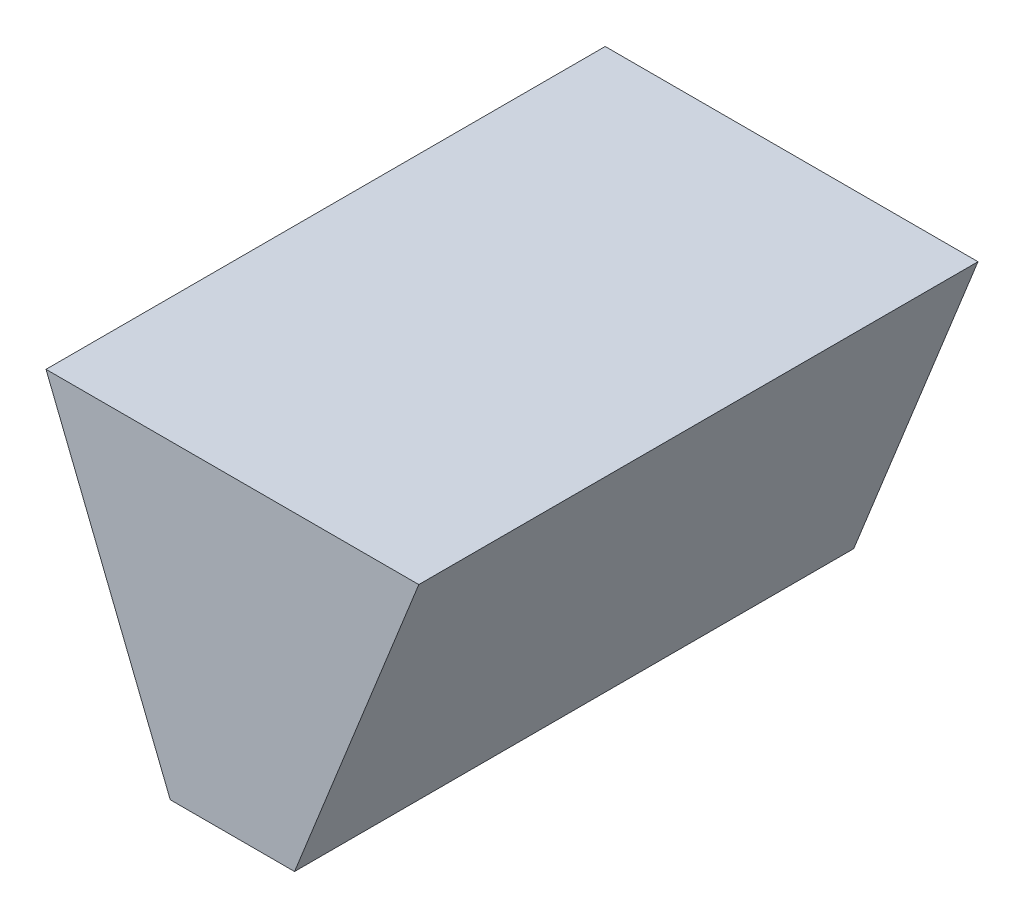
ISO-10303-21;
HEADER;
FILE_DESCRIPTION(('STEP AP214'),'2;1');
FILE_NAME('part.step','',(''),(''),'','','');
FILE_SCHEMA(('AUTOMOTIVE_DESIGN { 1 0 10303 214 1 1 1 1 }'));
ENDSEC;
DATA;
#1=APPLICATION_CONTEXT('core data for automotive mechanical design processes');
#2=APPLICATION_PROTOCOL_DEFINITION('international standard','automotive_design',2000,#1);
#3=PRODUCT_CONTEXT('',#1,'mechanical');
#4=PRODUCT('Part','Part','',(#3));
#5=PRODUCT_RELATED_PRODUCT_CATEGORY('part','',(#4));
#6=PRODUCT_DEFINITION_FORMATION('','',#4);
#7=PRODUCT_DEFINITION_CONTEXT('part definition',#1,'design');
#8=PRODUCT_DEFINITION('design','',#6,#7);
#9=PRODUCT_DEFINITION_SHAPE('','',#8);
#10=(LENGTH_UNIT() NAMED_UNIT(*) SI_UNIT(.MILLI.,.METRE.));
#11=(NAMED_UNIT(*) PLANE_ANGLE_UNIT() SI_UNIT($,.RADIAN.));
#12=(NAMED_UNIT(*) SI_UNIT($,.STERADIAN.) SOLID_ANGLE_UNIT());
#13=UNCERTAINTY_MEASURE_WITH_UNIT(LENGTH_MEASURE(1.E-05),#10,'distance_accuracy_value','');
#14=(GEOMETRIC_REPRESENTATION_CONTEXT(3) GLOBAL_UNCERTAINTY_ASSIGNED_CONTEXT((#13)) GLOBAL_UNIT_ASSIGNED_CONTEXT((#10,
#11,#12)) REPRESENTATION_CONTEXT('',''));
#15=CARTESIAN_POINT('',(0.,0.,0.));
#16=DIRECTION('',(0.,0.,1.));
#17=DIRECTION('',(1.,0.,0.));
#18=AXIS2_PLACEMENT_3D('',#15,#16,#17);
#19=CARTESIAN_POINT('',(-10.,0.,90.));
#20=DIRECTION('',(0.,1.,0.));
#21=DIRECTION('',(0.,0.,1.));
#22=AXIS2_PLACEMENT_3D('',#19,#20,#21);
#23=PLANE('',#22);
#24=DIRECTION('',(1.,0.,0.));
#25=VECTOR('',#24,1.);
#26=CARTESIAN_POINT('',(-10.,0.,0.));
#27=LINE('',#26,#25);
#28=CARTESIAN_POINT('',(-10.,0.,0.));
#29=VERTEX_POINT('',#28);
#30=CARTESIAN_POINT('',(10.,0.,0.));
#31=VERTEX_POINT('',#30);
#32=EDGE_CURVE('E78',#29,#31,#27,.T.);
#33=ORIENTED_EDGE('',*,*,#32,.T.);
#34=DIRECTION('',(0.,0.,-1.));
#35=VECTOR('',#34,1.);
#36=CARTESIAN_POINT('',(10.,0.,90.));
#37=LINE('',#36,#35);
#38=CARTESIAN_POINT('',(10.,0.,90.));
#39=VERTEX_POINT('',#38);
#40=EDGE_CURVE('E81',#39,#31,#37,.T.);
#41=ORIENTED_EDGE('',*,*,#40,.F.);
#42=DIRECTION('',(1.,0.,0.));
#43=VECTOR('',#42,1.);
#44=CARTESIAN_POINT('',(-10.,0.,90.));
#45=LINE('',#44,#43);
#46=CARTESIAN_POINT('',(-10.,0.,90.));
#47=VERTEX_POINT('',#46);
#48=EDGE_CURVE('E66',#47,#39,#45,.T.);
#49=ORIENTED_EDGE('',*,*,#48,.F.);
#50=DIRECTION('',(0.,0.,-1.));
#51=VECTOR('',#50,1.);
#52=CARTESIAN_POINT('',(-10.,0.,90.));
#53=LINE('',#52,#51);
#54=EDGE_CURVE('E41',#47,#29,#53,.T.);
#55=ORIENTED_EDGE('',*,*,#54,.T.);
#56=EDGE_LOOP('',(#33,#41,#49,#55));
#57=FACE_BOUND('',#56,.T.);
#58=ADVANCED_FACE('F33',(#57),#23,.F.);
#59=CARTESIAN_POINT('',(0.,50.,90.));
#60=DIRECTION('',(0.,-1.,0.));
#61=DIRECTION('',(1.,0.,0.));
#62=AXIS2_PLACEMENT_3D('',#59,#60,#61);
#63=PLANE('',#62);
#64=DIRECTION('',(-1.,0.,0.));
#65=VECTOR('',#64,1.);
#66=CARTESIAN_POINT('',(0.,50.,0.));
#67=LINE('',#66,#65);
#68=CARTESIAN_POINT('',(30.,50.,0.));
#69=VERTEX_POINT('',#68);
#70=CARTESIAN_POINT('',(-30.,50.,0.));
#71=VERTEX_POINT('',#70);
#72=EDGE_CURVE('E60',#69,#71,#67,.T.);
#73=ORIENTED_EDGE('',*,*,#72,.T.);
#74=DIRECTION('',(0.,0.,-1.));
#75=VECTOR('',#74,1.);
#76=CARTESIAN_POINT('',(-30.,50.,90.));
#77=LINE('',#76,#75);
#78=CARTESIAN_POINT('',(-30.,50.,90.));
#79=VERTEX_POINT('',#78);
#80=EDGE_CURVE('E11',#79,#71,#77,.T.);
#81=ORIENTED_EDGE('',*,*,#80,.F.);
#82=DIRECTION('',(-1.,0.,0.));
#83=VECTOR('',#82,1.);
#84=CARTESIAN_POINT('',(0.,50.,90.));
#85=LINE('',#84,#83);
#86=CARTESIAN_POINT('',(30.,50.,90.));
#87=VERTEX_POINT('',#86);
#88=EDGE_CURVE('E99',#87,#79,#85,.T.);
#89=ORIENTED_EDGE('',*,*,#88,.F.);
#90=DIRECTION('',(0.,0.,-1.));
#91=VECTOR('',#90,1.);
#92=CARTESIAN_POINT('',(30.,50.,90.));
#93=LINE('',#92,#91);
#94=EDGE_CURVE('E84',#87,#69,#93,.T.);
#95=ORIENTED_EDGE('',*,*,#94,.T.);
#96=EDGE_LOOP('',(#73,#81,#89,#95));
#97=FACE_BOUND('',#96,.T.);
#98=ADVANCED_FACE('F106',(#97),#63,.F.);
#99=CARTESIAN_POINT('',(-30.,50.,90.));
#100=DIRECTION('',(0.928476690885259,0.371390676354104,0.));
#101=DIRECTION('',(-0.371390676354104,0.928476690885259,0.));
#102=AXIS2_PLACEMENT_3D('',#99,#100,#101);
#103=PLANE('',#102);
#104=DIRECTION('',(0.371390676354104,-0.928476690885259,0.));
#105=VECTOR('',#104,1.);
#106=CARTESIAN_POINT('',(-30.,50.,0.));
#107=LINE('',#106,#105);
#108=EDGE_CURVE('E100',#71,#29,#107,.T.);
#109=ORIENTED_EDGE('',*,*,#108,.T.);
#110=ORIENTED_EDGE('',*,*,#54,.F.);
#111=DIRECTION('',(0.371390676354104,-0.928476690885259,0.));
#112=VECTOR('',#111,1.);
#113=CARTESIAN_POINT('',(-30.,50.,90.));
#114=LINE('',#113,#112);
#115=EDGE_CURVE('E49',#79,#47,#114,.T.);
#116=ORIENTED_EDGE('',*,*,#115,.F.);
#117=ORIENTED_EDGE('',*,*,#80,.T.);
#118=EDGE_LOOP('',(#109,#110,#116,#117));
#119=FACE_BOUND('',#118,.T.);
#120=ADVANCED_FACE('F105',(#119),#103,.F.);
#121=CARTESIAN_POINT('',(0.,0.,90.));
#122=DIRECTION('',(0.,0.,1.));
#123=DIRECTION('',(1.,0.,0.));
#124=AXIS2_PLACEMENT_3D('',#121,#122,#123);
#125=PLANE('',#124);
#126=ORIENTED_EDGE('',*,*,#48,.T.);
#127=DIRECTION('',(-0.371390676354104,-0.928476690885259,0.));
#128=VECTOR('',#127,1.);
#129=CARTESIAN_POINT('',(30.,50.,90.));
#130=LINE('',#129,#128);
#131=EDGE_CURVE('E91',#87,#39,#130,.T.);
#132=ORIENTED_EDGE('',*,*,#131,.F.);
#133=ORIENTED_EDGE('',*,*,#88,.T.);
#134=ORIENTED_EDGE('',*,*,#115,.T.);
#135=EDGE_LOOP('',(#126,#132,#133,#134));
#136=FACE_BOUND('',#135,.T.);
#137=ADVANCED_FACE('F107',(#136),#125,.T.);
#138=CARTESIAN_POINT('',(0.,0.,0.));
#139=DIRECTION('',(0.,0.,1.));
#140=DIRECTION('',(1.,0.,0.));
#141=AXIS2_PLACEMENT_3D('',#138,#139,#140);
#142=PLANE('',#141);
#143=ORIENTED_EDGE('',*,*,#32,.F.);
#144=ORIENTED_EDGE('',*,*,#108,.F.);
#145=ORIENTED_EDGE('',*,*,#72,.F.);
#146=DIRECTION('',(-0.371390676354104,-0.928476690885259,0.));
#147=VECTOR('',#146,1.);
#148=CARTESIAN_POINT('',(30.,50.,0.));
#149=LINE('',#148,#147);
#150=EDGE_CURVE('E87',#69,#31,#149,.T.);
#151=ORIENTED_EDGE('',*,*,#150,.T.);
#152=EDGE_LOOP('',(#143,#144,#145,#151));
#153=FACE_BOUND('',#152,.T.);
#154=ADVANCED_FACE('F88',(#153),#142,.F.);
#155=CARTESIAN_POINT('',(30.,50.,90.));
#156=DIRECTION('',(-0.928476690885259,0.371390676354104,0.));
#157=DIRECTION('',(0.371390676354104,0.928476690885259,0.));
#158=AXIS2_PLACEMENT_3D('',#155,#156,#157);
#159=PLANE('',#158);
#160=ORIENTED_EDGE('',*,*,#150,.F.);
#161=ORIENTED_EDGE('',*,*,#94,.F.);
#162=ORIENTED_EDGE('',*,*,#131,.T.);
#163=ORIENTED_EDGE('',*,*,#40,.T.);
#164=EDGE_LOOP('',(#160,#161,#162,#163));
#165=FACE_BOUND('',#164,.T.);
#166=ADVANCED_FACE('F93',(#165),#159,.F.);
#167=CLOSED_SHELL('',(#58,#98,#120,#137,#154,#166));
#168=MANIFOLD_SOLID_BREP('B2',#167);
#169=ADVANCED_BREP_SHAPE_REPRESENTATION('',(#18,#168),#14);
#170=SHAPE_DEFINITION_REPRESENTATION(#9,#169);
ENDSEC;
END-ISO-10303-21;
